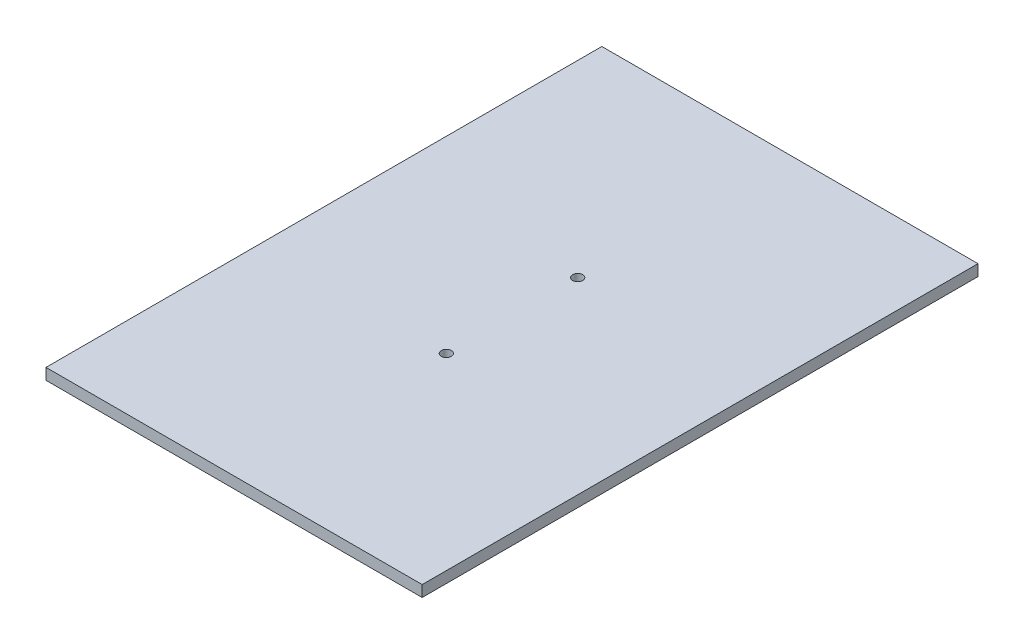
ISO-10303-21;
HEADER;
FILE_DESCRIPTION(('STEP AP214'),'2;1');
FILE_NAME('part.step','',(''),(''),'','','');
FILE_SCHEMA(('AUTOMOTIVE_DESIGN { 1 0 10303 214 1 1 1 1 }'));
ENDSEC;
DATA;
#1=APPLICATION_CONTEXT('core data for automotive mechanical design processes');
#2=APPLICATION_PROTOCOL_DEFINITION('international standard','automotive_design',2000,#1);
#3=PRODUCT_CONTEXT('',#1,'mechanical');
#4=PRODUCT('Part','Part','',(#3));
#5=PRODUCT_RELATED_PRODUCT_CATEGORY('part','',(#4));
#6=PRODUCT_DEFINITION_FORMATION('','',#4);
#7=PRODUCT_DEFINITION_CONTEXT('part definition',#1,'design');
#8=PRODUCT_DEFINITION('design','',#6,#7);
#9=PRODUCT_DEFINITION_SHAPE('','',#8);
#10=(LENGTH_UNIT() NAMED_UNIT(*) SI_UNIT(.MILLI.,.METRE.));
#11=(NAMED_UNIT(*) PLANE_ANGLE_UNIT() SI_UNIT($,.RADIAN.));
#12=(NAMED_UNIT(*) SI_UNIT($,.STERADIAN.) SOLID_ANGLE_UNIT());
#13=UNCERTAINTY_MEASURE_WITH_UNIT(LENGTH_MEASURE(1.E-05),#10,'distance_accuracy_value','');
#14=(GEOMETRIC_REPRESENTATION_CONTEXT(3) GLOBAL_UNCERTAINTY_ASSIGNED_CONTEXT((#13)) GLOBAL_UNIT_ASSIGNED_CONTEXT((#10,
#11,#12)) REPRESENTATION_CONTEXT('',''));
#15=CARTESIAN_POINT('',(0.,0.,0.));
#16=DIRECTION('',(0.,0.,1.));
#17=DIRECTION('',(1.,0.,0.));
#18=AXIS2_PLACEMENT_3D('',#15,#16,#17);
#19=CARTESIAN_POINT('',(167.499999999999,4.99999999999999,247.5));
#20=DIRECTION('',(-1.,0.,0.));
#21=DIRECTION('',(0.,-1.,0.));
#22=AXIS2_PLACEMENT_3D('',#19,#20,#21);
#23=PLANE('',#22);
#24=DIRECTION('',(0.,1.,0.));
#25=VECTOR('',#24,1.);
#26=CARTESIAN_POINT('',(167.499999999999,4.99999999999999,-247.5));
#27=LINE('',#26,#25);
#28=CARTESIAN_POINT('',(167.499999999999,-5.00000000000002,-247.5));
#29=VERTEX_POINT('',#28);
#30=CARTESIAN_POINT('',(167.499999999999,4.99999999999999,-247.5));
#31=VERTEX_POINT('',#30);
#32=EDGE_CURVE('E98',#29,#31,#27,.T.);
#33=ORIENTED_EDGE('',*,*,#32,.T.);
#34=DIRECTION('',(0.,0.,-1.));
#35=VECTOR('',#34,1.);
#36=CARTESIAN_POINT('',(167.499999999999,4.99999999999999,247.5));
#37=LINE('',#36,#35);
#38=CARTESIAN_POINT('',(167.499999999999,4.99999999999999,247.5));
#39=VERTEX_POINT('',#38);
#40=EDGE_CURVE('E11',#39,#31,#37,.T.);
#41=ORIENTED_EDGE('',*,*,#40,.F.);
#42=DIRECTION('',(0.,1.,0.));
#43=VECTOR('',#42,1.);
#44=CARTESIAN_POINT('',(167.499999999999,4.99999999999999,247.5));
#45=LINE('',#44,#43);
#46=CARTESIAN_POINT('',(167.499999999999,-5.00000000000002,247.5));
#47=VERTEX_POINT('',#46);
#48=EDGE_CURVE('E86',#47,#39,#45,.T.);
#49=ORIENTED_EDGE('',*,*,#48,.F.);
#50=DIRECTION('',(0.,0.,-1.));
#51=VECTOR('',#50,1.);
#52=CARTESIAN_POINT('',(167.499999999999,-5.00000000000002,247.5));
#53=LINE('',#52,#51);
#54=EDGE_CURVE('E94',#47,#29,#53,.T.);
#55=ORIENTED_EDGE('',*,*,#54,.T.);
#56=EDGE_LOOP('',(#33,#41,#49,#55));
#57=FACE_BOUND('',#56,.T.);
#58=ADVANCED_FACE('F35',(#57),#23,.F.);
#59=CARTESIAN_POINT('',(-167.500000000001,4.99999999999999,247.5));
#60=DIRECTION('',(0.,-1.,0.));
#61=DIRECTION('',(0.,0.,-1.));
#62=AXIS2_PLACEMENT_3D('',#59,#60,#61);
#63=PLANE('',#62);
#64=CARTESIAN_POINT('',(0.,4.99999999999999,-58.5));
#65=DIRECTION('',(0.,1.,0.));
#66=DIRECTION('',(0.,0.,1.));
#67=AXIS2_PLACEMENT_3D('',#64,#65,#66);
#68=CIRCLE('',#67,4.49999999999999);
#69=CARTESIAN_POINT('',(0.,4.99999999999999,-54.));
#70=VERTEX_POINT('',#69);
#71=EDGE_CURVE('E120',#70,#70,#68,.T.);
#72=ORIENTED_EDGE('',*,*,#71,.F.);
#73=EDGE_LOOP('',(#72));
#74=FACE_BOUND('',#73,.T.);
#75=CARTESIAN_POINT('',(0.,4.99999999999999,58.5));
#76=DIRECTION('',(0.,1.,0.));
#77=DIRECTION('',(0.,0.,1.));
#78=AXIS2_PLACEMENT_3D('',#75,#76,#77);
#79=CIRCLE('',#78,4.49999999999999);
#80=CARTESIAN_POINT('',(0.,4.99999999999999,63.));
#81=VERTEX_POINT('',#80);
#82=EDGE_CURVE('E114',#81,#81,#79,.T.);
#83=ORIENTED_EDGE('',*,*,#82,.F.);
#84=EDGE_LOOP('',(#83));
#85=FACE_BOUND('',#84,.T.);
#86=DIRECTION('',(-1.,0.,0.));
#87=VECTOR('',#86,1.);
#88=CARTESIAN_POINT('',(-167.500000000001,4.99999999999999,-247.5));
#89=LINE('',#88,#87);
#90=CARTESIAN_POINT('',(-167.500000000001,4.99999999999999,-247.5));
#91=VERTEX_POINT('',#90);
#92=EDGE_CURVE('E90',#31,#91,#89,.T.);
#93=ORIENTED_EDGE('',*,*,#92,.T.);
#94=DIRECTION('',(0.,0.,-1.));
#95=VECTOR('',#94,1.);
#96=CARTESIAN_POINT('',(-167.500000000001,4.99999999999999,247.5));
#97=LINE('',#96,#95);
#98=CARTESIAN_POINT('',(-167.500000000001,4.99999999999999,247.5));
#99=VERTEX_POINT('',#98);
#100=EDGE_CURVE('E43',#99,#91,#97,.T.);
#101=ORIENTED_EDGE('',*,*,#100,.F.);
#102=DIRECTION('',(-1.,0.,0.));
#103=VECTOR('',#102,1.);
#104=CARTESIAN_POINT('',(-167.500000000001,4.99999999999999,247.5));
#105=LINE('',#104,#103);
#106=EDGE_CURVE('E81',#39,#99,#105,.T.);
#107=ORIENTED_EDGE('',*,*,#106,.F.);
#108=ORIENTED_EDGE('',*,*,#40,.T.);
#109=EDGE_LOOP('',(#93,#101,#107,#108));
#110=FACE_BOUND('',#109,.T.);
#111=ADVANCED_FACE('F89',(#74,#85,#110),#63,.F.);
#112=CARTESIAN_POINT('',(-167.500000000001,4.99999999999999,247.5));
#113=DIRECTION('',(1.,0.,0.));
#114=DIRECTION('',(0.,0.,-1.));
#115=AXIS2_PLACEMENT_3D('',#112,#113,#114);
#116=PLANE('',#115);
#117=DIRECTION('',(0.,-1.,0.));
#118=VECTOR('',#117,1.);
#119=CARTESIAN_POINT('',(-167.500000000001,4.99999999999999,-247.5));
#120=LINE('',#119,#118);
#121=CARTESIAN_POINT('',(-167.500000000001,-5.00000000000002,-247.5));
#122=VERTEX_POINT('',#121);
#123=EDGE_CURVE('E68',#91,#122,#120,.T.);
#124=ORIENTED_EDGE('',*,*,#123,.T.);
#125=DIRECTION('',(0.,0.,-1.));
#126=VECTOR('',#125,1.);
#127=CARTESIAN_POINT('',(-167.500000000001,-5.00000000000002,247.5));
#128=LINE('',#127,#126);
#129=CARTESIAN_POINT('',(-167.500000000001,-5.00000000000002,247.5));
#130=VERTEX_POINT('',#129);
#131=EDGE_CURVE('E91',#130,#122,#128,.T.);
#132=ORIENTED_EDGE('',*,*,#131,.F.);
#133=DIRECTION('',(0.,-1.,0.));
#134=VECTOR('',#133,1.);
#135=CARTESIAN_POINT('',(-167.500000000001,4.99999999999999,247.5));
#136=LINE('',#135,#134);
#137=EDGE_CURVE('E84',#99,#130,#136,.T.);
#138=ORIENTED_EDGE('',*,*,#137,.F.);
#139=ORIENTED_EDGE('',*,*,#100,.T.);
#140=EDGE_LOOP('',(#124,#132,#138,#139));
#141=FACE_BOUND('',#140,.T.);
#142=ADVANCED_FACE('F92',(#141),#116,.F.);
#143=CARTESIAN_POINT('',(-167.500000000001,-5.00000000000002,247.5));
#144=DIRECTION('',(0.,1.,0.));
#145=DIRECTION('',(0.,0.,1.));
#146=AXIS2_PLACEMENT_3D('',#143,#144,#145);
#147=PLANE('',#146);
#148=CARTESIAN_POINT('',(0.,-5.00000000000002,-58.5));
#149=DIRECTION('',(0.,1.,0.));
#150=DIRECTION('',(0.,0.,1.));
#151=AXIS2_PLACEMENT_3D('',#148,#149,#150);
#152=CIRCLE('',#151,4.5);
#153=CARTESIAN_POINT('',(0.,-5.00000000000002,-54.));
#154=VERTEX_POINT('',#153);
#155=EDGE_CURVE('E117',#154,#154,#152,.T.);
#156=ORIENTED_EDGE('',*,*,#155,.T.);
#157=EDGE_LOOP('',(#156));
#158=FACE_BOUND('',#157,.T.);
#159=CARTESIAN_POINT('',(0.,-5.00000000000002,58.5));
#160=DIRECTION('',(0.,1.,0.));
#161=DIRECTION('',(0.,0.,1.));
#162=AXIS2_PLACEMENT_3D('',#159,#160,#161);
#163=CIRCLE('',#162,4.5);
#164=CARTESIAN_POINT('',(0.,-5.00000000000002,63.));
#165=VERTEX_POINT('',#164);
#166=EDGE_CURVE('E101',#165,#165,#163,.T.);
#167=ORIENTED_EDGE('',*,*,#166,.T.);
#168=EDGE_LOOP('',(#167));
#169=FACE_BOUND('',#168,.T.);
#170=DIRECTION('',(1.,0.,0.));
#171=VECTOR('',#170,1.);
#172=CARTESIAN_POINT('',(-167.500000000001,-5.00000000000002,-247.5));
#173=LINE('',#172,#171);
#174=EDGE_CURVE('E74',#122,#29,#173,.T.);
#175=ORIENTED_EDGE('',*,*,#174,.T.);
#176=ORIENTED_EDGE('',*,*,#54,.F.);
#177=DIRECTION('',(1.,0.,0.));
#178=VECTOR('',#177,1.);
#179=CARTESIAN_POINT('',(-167.500000000001,-5.00000000000002,247.5));
#180=LINE('',#179,#178);
#181=EDGE_CURVE('E51',#130,#47,#180,.T.);
#182=ORIENTED_EDGE('',*,*,#181,.F.);
#183=ORIENTED_EDGE('',*,*,#131,.T.);
#184=EDGE_LOOP('',(#175,#176,#182,#183));
#185=FACE_BOUND('',#184,.T.);
#186=ADVANCED_FACE('F106',(#158,#169,#185),#147,.F.);
#187=CARTESIAN_POINT('',(0.,0.,247.5));
#188=DIRECTION('',(0.,0.,1.));
#189=DIRECTION('',(1.,0.,0.));
#190=AXIS2_PLACEMENT_3D('',#187,#188,#189);
#191=PLANE('',#190);
#192=ORIENTED_EDGE('',*,*,#48,.T.);
#193=ORIENTED_EDGE('',*,*,#106,.T.);
#194=ORIENTED_EDGE('',*,*,#137,.T.);
#195=ORIENTED_EDGE('',*,*,#181,.T.);
#196=EDGE_LOOP('',(#192,#193,#194,#195));
#197=FACE_BOUND('',#196,.T.);
#198=ADVANCED_FACE('F82',(#197),#191,.T.);
#199=CARTESIAN_POINT('',(0.,0.,-247.5));
#200=DIRECTION('',(0.,0.,1.));
#201=DIRECTION('',(1.,0.,0.));
#202=AXIS2_PLACEMENT_3D('',#199,#200,#201);
#203=PLANE('',#202);
#204=ORIENTED_EDGE('',*,*,#32,.F.);
#205=ORIENTED_EDGE('',*,*,#174,.F.);
#206=ORIENTED_EDGE('',*,*,#123,.F.);
#207=ORIENTED_EDGE('',*,*,#92,.F.);
#208=EDGE_LOOP('',(#204,#205,#206,#207));
#209=FACE_BOUND('',#208,.T.);
#210=ADVANCED_FACE('F109',(#209),#203,.F.);
#211=CARTESIAN_POINT('',(0.,4.99999999999999,58.5));
#212=DIRECTION('',(0.,1.,0.));
#213=DIRECTION('',(0.,0.,1.));
#214=AXIS2_PLACEMENT_3D('',#211,#212,#213);
#215=CYLINDRICAL_SURFACE('',#214,4.49999999999999);
#216=ORIENTED_EDGE('',*,*,#166,.F.);
#217=EDGE_LOOP('',(#216));
#218=FACE_BOUND('',#217,.T.);
#219=ORIENTED_EDGE('',*,*,#82,.T.);
#220=EDGE_LOOP('',(#219));
#221=FACE_BOUND('',#220,.T.);
#222=ADVANCED_FACE('F130',(#218,#221),#215,.F.);
#223=CARTESIAN_POINT('',(0.,4.99999999999999,-58.5));
#224=DIRECTION('',(0.,1.,0.));
#225=DIRECTION('',(0.,0.,1.));
#226=AXIS2_PLACEMENT_3D('',#223,#224,#225);
#227=CYLINDRICAL_SURFACE('',#226,4.49999999999999);
#228=ORIENTED_EDGE('',*,*,#155,.F.);
#229=EDGE_LOOP('',(#228));
#230=FACE_BOUND('',#229,.T.);
#231=ORIENTED_EDGE('',*,*,#71,.T.);
#232=EDGE_LOOP('',(#231));
#233=FACE_BOUND('',#232,.T.);
#234=ADVANCED_FACE('F124',(#230,#233),#227,.F.);
#235=CLOSED_SHELL('',(#58,#111,#142,#186,#198,#210,#222,#234));
#236=MANIFOLD_SOLID_BREP('B2',#235);
#237=ADVANCED_BREP_SHAPE_REPRESENTATION('',(#18,#236),#14);
#238=SHAPE_DEFINITION_REPRESENTATION(#9,#237);
ENDSEC;
END-ISO-10303-21;
